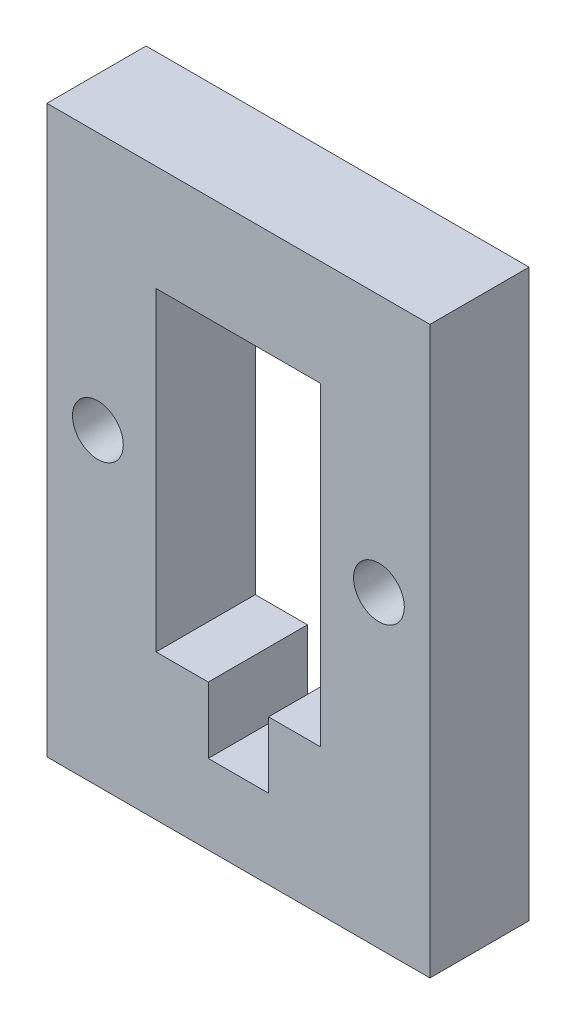
ISO-10303-21;
HEADER;
FILE_DESCRIPTION(('STEP AP214'),'2;1');
FILE_NAME('part.step','',(''),(''),'','','');
FILE_SCHEMA(('AUTOMOTIVE_DESIGN { 1 0 10303 214 1 1 1 1 }'));
ENDSEC;
DATA;
#1=APPLICATION_CONTEXT('core data for automotive mechanical design processes');
#2=APPLICATION_PROTOCOL_DEFINITION('international standard','automotive_design',2000,#1);
#3=PRODUCT_CONTEXT('',#1,'mechanical');
#4=PRODUCT('Part','Part','',(#3));
#5=PRODUCT_RELATED_PRODUCT_CATEGORY('part','',(#4));
#6=PRODUCT_DEFINITION_FORMATION('','',#4);
#7=PRODUCT_DEFINITION_CONTEXT('part definition',#1,'design');
#8=PRODUCT_DEFINITION('design','',#6,#7);
#9=PRODUCT_DEFINITION_SHAPE('','',#8);
#10=(LENGTH_UNIT() NAMED_UNIT(*) SI_UNIT(.MILLI.,.METRE.));
#11=(NAMED_UNIT(*) PLANE_ANGLE_UNIT() SI_UNIT($,.RADIAN.));
#12=(NAMED_UNIT(*) SI_UNIT($,.STERADIAN.) SOLID_ANGLE_UNIT());
#13=UNCERTAINTY_MEASURE_WITH_UNIT(LENGTH_MEASURE(1.E-05),#10,'distance_accuracy_value','');
#14=(GEOMETRIC_REPRESENTATION_CONTEXT(3) GLOBAL_UNCERTAINTY_ASSIGNED_CONTEXT((#13)) GLOBAL_UNIT_ASSIGNED_CONTEXT((#10,
#11,#12)) REPRESENTATION_CONTEXT('',''));
#15=CARTESIAN_POINT('',(0.,0.,0.));
#16=DIRECTION('',(0.,0.,1.));
#17=DIRECTION('',(1.,0.,0.));
#18=AXIS2_PLACEMENT_3D('',#15,#16,#17);
#19=CARTESIAN_POINT('',(-18.5582300884956,31.0897345132743,7.5));
#20=DIRECTION('',(0.,-1.,0.));
#21=DIRECTION('',(0.,0.,-1.));
#22=AXIS2_PLACEMENT_3D('',#19,#20,#21);
#23=PLANE('',#22);
#24=DIRECTION('',(-1.,0.,0.));
#25=VECTOR('',#24,1.);
#26=CARTESIAN_POINT('',(-18.5582300884956,31.0897345132743,7.5));
#27=LINE('',#26,#25);
#28=CARTESIAN_POINT('',(-6.35823008849556,31.0897345132743,7.5));
#29=VERTEX_POINT('',#28);
#30=CARTESIAN_POINT('',(-10.3032300884956,31.0897345132743,7.5));
#31=VERTEX_POINT('',#30);
#32=EDGE_CURVE('E244',#29,#31,#27,.T.);
#33=ORIENTED_EDGE('',*,*,#32,.F.);
#34=DIRECTION('',(0.,0.,1.));
#35=VECTOR('',#34,1.);
#36=CARTESIAN_POINT('',(-6.35823008849556,31.0897345132743,0.));
#37=LINE('',#36,#35);
#38=CARTESIAN_POINT('',(-6.35823008849556,31.0897345132743,0.));
#39=VERTEX_POINT('',#38);
#40=EDGE_CURVE('E138',#39,#29,#37,.T.);
#41=ORIENTED_EDGE('',*,*,#40,.F.);
#42=DIRECTION('',(-1.,0.,0.));
#43=VECTOR('',#42,1.);
#44=CARTESIAN_POINT('',(-18.5582300884956,31.0897345132743,0.));
#45=LINE('',#44,#43);
#46=CARTESIAN_POINT('',(-10.3032300884956,31.0897345132743,0.));
#47=VERTEX_POINT('',#46);
#48=EDGE_CURVE('E256',#39,#47,#45,.T.);
#49=ORIENTED_EDGE('',*,*,#48,.T.);
#50=DIRECTION('',(0.,0.,-1.));
#51=VECTOR('',#50,1.);
#52=CARTESIAN_POINT('',(-10.3032300884956,31.0897345132743,0.));
#53=LINE('',#52,#51);
#54=EDGE_CURVE('E216',#31,#47,#53,.T.);
#55=ORIENTED_EDGE('',*,*,#54,.F.);
#56=EDGE_LOOP('',(#33,#41,#49,#55));
#57=FACE_BOUND('',#56,.T.);
#58=ADVANCED_FACE('F39',(#57),#23,.F.);
#59=CARTESIAN_POINT('',(2.14676991150445,31.0897345132743,0.));
#60=VERTEX_POINT('',#59);
#61=CARTESIAN_POINT('',(-1.79823008849555,31.0897345132743,0.));
#62=VERTEX_POINT('',#61);
#63=EDGE_CURVE('E238',#60,#62,#45,.T.);
#64=ORIENTED_EDGE('',*,*,#63,.T.);
#65=DIRECTION('',(0.,0.,-1.));
#66=VECTOR('',#65,1.);
#67=CARTESIAN_POINT('',(-1.79823008849555,31.0897345132743,0.));
#68=LINE('',#67,#66);
#69=CARTESIAN_POINT('',(-1.79823008849555,31.0897345132743,7.5));
#70=VERTEX_POINT('',#69);
#71=EDGE_CURVE('E152',#70,#62,#68,.T.);
#72=ORIENTED_EDGE('',*,*,#71,.F.);
#73=CARTESIAN_POINT('',(2.14676991150444,31.0897345132743,7.5));
#74=VERTEX_POINT('',#73);
#75=EDGE_CURVE('E65',#74,#70,#27,.T.);
#76=ORIENTED_EDGE('',*,*,#75,.F.);
#77=DIRECTION('',(0.,0.,1.));
#78=VECTOR('',#77,1.);
#79=CARTESIAN_POINT('',(2.14676991150445,31.0897345132743,0.));
#80=LINE('',#79,#78);
#81=EDGE_CURVE('E195',#60,#74,#80,.T.);
#82=ORIENTED_EDGE('',*,*,#81,.F.);
#83=EDGE_LOOP('',(#64,#72,#76,#82));
#84=FACE_BOUND('',#83,.T.);
#85=ADVANCED_FACE('F300',(#84),#23,.F.);
#86=CARTESIAN_POINT('',(-18.5582300884956,31.0897345132743,7.5));
#87=DIRECTION('',(1.,0.,0.));
#88=DIRECTION('',(0.,1.,0.));
#89=AXIS2_PLACEMENT_3D('',#86,#87,#88);
#90=PLANE('',#89);
#91=DIRECTION('',(0.,-1.,0.));
#92=VECTOR('',#91,1.);
#93=CARTESIAN_POINT('',(-18.5582300884956,31.0897345132743,0.));
#94=LINE('',#93,#92);
#95=CARTESIAN_POINT('',(-18.5582300884956,62.8897345132743,0.));
#96=VERTEX_POINT('',#95);
#97=CARTESIAN_POINT('',(-18.5582300884956,20.0897345132743,0.));
#98=VERTEX_POINT('',#97);
#99=EDGE_CURVE('E232',#96,#98,#94,.T.);
#100=ORIENTED_EDGE('',*,*,#99,.T.);
#101=DIRECTION('',(0.,0.,-1.));
#102=VECTOR('',#101,1.);
#103=CARTESIAN_POINT('',(-18.5582300884956,20.0897345132743,7.5));
#104=LINE('',#103,#102);
#105=CARTESIAN_POINT('',(-18.5582300884956,20.0897345132743,7.5));
#106=VERTEX_POINT('',#105);
#107=EDGE_CURVE('E11',#106,#98,#104,.T.);
#108=ORIENTED_EDGE('',*,*,#107,.F.);
#109=DIRECTION('',(0.,-1.,0.));
#110=VECTOR('',#109,1.);
#111=CARTESIAN_POINT('',(-18.5582300884956,31.0897345132743,7.5));
#112=LINE('',#111,#110);
#113=CARTESIAN_POINT('',(-18.5582300884956,62.8897345132743,7.5));
#114=VERTEX_POINT('',#113);
#115=EDGE_CURVE('E233',#114,#106,#112,.T.);
#116=ORIENTED_EDGE('',*,*,#115,.F.);
#117=DIRECTION('',(0.,0.,1.));
#118=VECTOR('',#117,1.);
#119=CARTESIAN_POINT('',(-18.5582300884956,62.8897345132743,0.));
#120=LINE('',#119,#118);
#121=EDGE_CURVE('E178',#96,#114,#120,.T.);
#122=ORIENTED_EDGE('',*,*,#121,.F.);
#123=EDGE_LOOP('',(#100,#108,#116,#122));
#124=FACE_BOUND('',#123,.T.);
#125=ADVANCED_FACE('F41',(#124),#90,.F.);
#126=CARTESIAN_POINT('',(-18.5582300884956,20.0897345132743,7.5));
#127=DIRECTION('',(0.,1.,0.));
#128=DIRECTION('',(0.,0.,1.));
#129=AXIS2_PLACEMENT_3D('',#126,#127,#128);
#130=PLANE('',#129);
#131=DIRECTION('',(1.,0.,0.));
#132=VECTOR('',#131,1.);
#133=CARTESIAN_POINT('',(-18.5582300884956,20.0897345132743,0.));
#134=LINE('',#133,#132);
#135=CARTESIAN_POINT('',(10.4017699115044,20.0897345132743,0.));
#136=VERTEX_POINT('',#135);
#137=EDGE_CURVE('E250',#98,#136,#134,.T.);
#138=ORIENTED_EDGE('',*,*,#137,.T.);
#139=DIRECTION('',(0.,0.,-1.));
#140=VECTOR('',#139,1.);
#141=CARTESIAN_POINT('',(10.4017699115044,20.0897345132743,7.5));
#142=LINE('',#141,#140);
#143=CARTESIAN_POINT('',(10.4017699115044,20.0897345132743,7.5));
#144=VERTEX_POINT('',#143);
#145=EDGE_CURVE('E49',#144,#136,#142,.T.);
#146=ORIENTED_EDGE('',*,*,#145,.F.);
#147=DIRECTION('',(1.,0.,0.));
#148=VECTOR('',#147,1.);
#149=CARTESIAN_POINT('',(-18.5582300884956,20.0897345132743,7.5));
#150=LINE('',#149,#148);
#151=EDGE_CURVE('E237',#106,#144,#150,.T.);
#152=ORIENTED_EDGE('',*,*,#151,.F.);
#153=ORIENTED_EDGE('',*,*,#107,.T.);
#154=EDGE_LOOP('',(#138,#146,#152,#153));
#155=FACE_BOUND('',#154,.T.);
#156=ADVANCED_FACE('F295',(#155),#130,.F.);
#157=CARTESIAN_POINT('',(10.4017699115044,31.0897345132743,7.5));
#158=DIRECTION('',(-1.,0.,0.));
#159=DIRECTION('',(0.,-1.,0.));
#160=AXIS2_PLACEMENT_3D('',#157,#158,#159);
#161=PLANE('',#160);
#162=DIRECTION('',(0.,1.,0.));
#163=VECTOR('',#162,1.);
#164=CARTESIAN_POINT('',(10.4017699115044,31.0897345132743,0.));
#165=LINE('',#164,#163);
#166=CARTESIAN_POINT('',(10.4017699115044,62.8897345132743,0.));
#167=VERTEX_POINT('',#166);
#168=EDGE_CURVE('E253',#136,#167,#165,.T.);
#169=ORIENTED_EDGE('',*,*,#168,.T.);
#170=DIRECTION('',(0.,0.,-1.));
#171=VECTOR('',#170,1.);
#172=CARTESIAN_POINT('',(10.4017699115044,62.8897345132743,0.));
#173=LINE('',#172,#171);
#174=CARTESIAN_POINT('',(10.4017699115044,62.8897345132743,7.5));
#175=VERTEX_POINT('',#174);
#176=EDGE_CURVE('E187',#175,#167,#173,.T.);
#177=ORIENTED_EDGE('',*,*,#176,.F.);
#178=DIRECTION('',(0.,1.,0.));
#179=VECTOR('',#178,1.);
#180=CARTESIAN_POINT('',(10.4017699115044,31.0897345132743,7.5));
#181=LINE('',#180,#179);
#182=EDGE_CURVE('E241',#144,#175,#181,.T.);
#183=ORIENTED_EDGE('',*,*,#182,.F.);
#184=ORIENTED_EDGE('',*,*,#145,.T.);
#185=EDGE_LOOP('',(#169,#177,#183,#184));
#186=FACE_BOUND('',#185,.T.);
#187=ADVANCED_FACE('F285',(#186),#161,.F.);
#188=CARTESIAN_POINT('',(0.,0.,7.5));
#189=DIRECTION('',(0.,0.,1.));
#190=DIRECTION('',(1.,0.,0.));
#191=AXIS2_PLACEMENT_3D('',#188,#189,#190);
#192=PLANE('',#191);
#193=CARTESIAN_POINT('',(-14.7032300884956,43.4097345132743,7.5));
#194=DIRECTION('',(0.,0.,1.));
#195=DIRECTION('',(1.,0.,0.));
#196=AXIS2_PLACEMENT_3D('',#193,#194,#195);
#197=CIRCLE('',#196,1.92);
#198=CARTESIAN_POINT('',(-12.7832300884956,43.4097345132743,7.5));
#199=VERTEX_POINT('',#198);
#200=EDGE_CURVE('E265',#199,#199,#197,.T.);
#201=ORIENTED_EDGE('',*,*,#200,.F.);
#202=EDGE_LOOP('',(#201));
#203=FACE_BOUND('',#202,.T.);
#204=CARTESIAN_POINT('',(6.54676991150445,43.4097345132743,7.5));
#205=DIRECTION('',(0.,0.,1.));
#206=DIRECTION('',(1.,0.,0.));
#207=AXIS2_PLACEMENT_3D('',#204,#205,#206);
#208=CIRCLE('',#207,1.92);
#209=CARTESIAN_POINT('',(8.46676991150445,43.4097345132743,7.5));
#210=VERTEX_POINT('',#209);
#211=EDGE_CURVE('E272',#210,#210,#208,.T.);
#212=ORIENTED_EDGE('',*,*,#211,.F.);
#213=EDGE_LOOP('',(#212));
#214=FACE_BOUND('',#213,.T.);
#215=DIRECTION('',(0.,1.,0.));
#216=VECTOR('',#215,1.);
#217=CARTESIAN_POINT('',(-6.35823008849556,26.0897345132743,7.5));
#218=LINE('',#217,#216);
#219=CARTESIAN_POINT('',(-6.35823008849556,26.0897345132743,7.5));
#220=VERTEX_POINT('',#219);
#221=EDGE_CURVE('E133',#220,#29,#218,.T.);
#222=ORIENTED_EDGE('',*,*,#221,.T.);
#223=ORIENTED_EDGE('',*,*,#32,.T.);
#224=DIRECTION('',(0.,-1.,0.));
#225=VECTOR('',#224,1.);
#226=CARTESIAN_POINT('',(-10.3032300884956,54.8897345132743,7.5));
#227=LINE('',#226,#225);
#228=CARTESIAN_POINT('',(-10.3032300884956,54.8897345132743,7.5));
#229=VERTEX_POINT('',#228);
#230=EDGE_CURVE('E228',#229,#31,#227,.T.);
#231=ORIENTED_EDGE('',*,*,#230,.F.);
#232=DIRECTION('',(1.,0.,0.));
#233=VECTOR('',#232,1.);
#234=CARTESIAN_POINT('',(-18.5582300884956,54.8897345132743,7.5));
#235=LINE('',#234,#233);
#236=CARTESIAN_POINT('',(2.14676991150444,54.8897345132743,7.5));
#237=VERTEX_POINT('',#236);
#238=EDGE_CURVE('E171',#229,#237,#235,.T.);
#239=ORIENTED_EDGE('',*,*,#238,.T.);
#240=DIRECTION('',(0.,-1.,0.));
#241=VECTOR('',#240,1.);
#242=CARTESIAN_POINT('',(2.14676991150444,54.8897345132743,7.5));
#243=LINE('',#242,#241);
#244=EDGE_CURVE('E206',#237,#74,#243,.T.);
#245=ORIENTED_EDGE('',*,*,#244,.T.);
#246=ORIENTED_EDGE('',*,*,#75,.T.);
#247=DIRECTION('',(0.,1.,0.));
#248=VECTOR('',#247,1.);
#249=CARTESIAN_POINT('',(-1.79823008849555,26.0897345132743,7.5));
#250=LINE('',#249,#248);
#251=CARTESIAN_POINT('',(-1.79823008849555,26.0897345132743,7.5));
#252=VERTEX_POINT('',#251);
#253=EDGE_CURVE('E143',#252,#70,#250,.T.);
#254=ORIENTED_EDGE('',*,*,#253,.F.);
#255=DIRECTION('',(1.,0.,0.));
#256=VECTOR('',#255,1.);
#257=CARTESIAN_POINT('',(-6.35823008849556,26.0897345132743,7.5));
#258=LINE('',#257,#256);
#259=EDGE_CURVE('E147',#220,#252,#258,.T.);
#260=ORIENTED_EDGE('',*,*,#259,.F.);
#261=EDGE_LOOP('',(#222,#223,#231,#239,#245,#246,#254,#260));
#262=FACE_BOUND('',#261,.T.);
#263=ORIENTED_EDGE('',*,*,#115,.T.);
#264=ORIENTED_EDGE('',*,*,#151,.T.);
#265=ORIENTED_EDGE('',*,*,#182,.T.);
#266=DIRECTION('',(1.,0.,0.));
#267=VECTOR('',#266,1.);
#268=CARTESIAN_POINT('',(-18.5582300884956,62.8897345132743,7.5));
#269=LINE('',#268,#267);
#270=EDGE_CURVE('E182',#114,#175,#269,.T.);
#271=ORIENTED_EDGE('',*,*,#270,.F.);
#272=EDGE_LOOP('',(#263,#264,#265,#271));
#273=FACE_BOUND('',#272,.T.);
#274=ADVANCED_FACE('F154',(#203,#214,#262,#273),#192,.T.);
#275=CARTESIAN_POINT('',(0.,0.,0.));
#276=DIRECTION('',(0.,0.,1.));
#277=DIRECTION('',(1.,0.,0.));
#278=AXIS2_PLACEMENT_3D('',#275,#276,#277);
#279=PLANE('',#278);
#280=CARTESIAN_POINT('',(-14.7032300884956,43.4097345132743,0.));
#281=DIRECTION('',(0.,0.,1.));
#282=DIRECTION('',(1.,0.,0.));
#283=AXIS2_PLACEMENT_3D('',#280,#281,#282);
#284=CIRCLE('',#283,1.92);
#285=CARTESIAN_POINT('',(-12.7832300884956,43.4097345132743,0.));
#286=VERTEX_POINT('',#285);
#287=EDGE_CURVE('E43',#286,#286,#284,.T.);
#288=ORIENTED_EDGE('',*,*,#287,.T.);
#289=EDGE_LOOP('',(#288));
#290=FACE_BOUND('',#289,.T.);
#291=CARTESIAN_POINT('',(6.54676991150445,43.4097345132743,0.));
#292=DIRECTION('',(0.,0.,1.));
#293=DIRECTION('',(1.,0.,0.));
#294=AXIS2_PLACEMENT_3D('',#291,#292,#293);
#295=CIRCLE('',#294,1.92);
#296=CARTESIAN_POINT('',(8.46676991150445,43.4097345132743,0.));
#297=VERTEX_POINT('',#296);
#298=EDGE_CURVE('E262',#297,#297,#295,.T.);
#299=ORIENTED_EDGE('',*,*,#298,.T.);
#300=EDGE_LOOP('',(#299));
#301=FACE_BOUND('',#300,.T.);
#302=ORIENTED_EDGE('',*,*,#48,.F.);
#303=DIRECTION('',(0.,1.,0.));
#304=VECTOR('',#303,1.);
#305=CARTESIAN_POINT('',(-6.35823008849556,26.0897345132743,0.));
#306=LINE('',#305,#304);
#307=CARTESIAN_POINT('',(-6.35823008849556,26.0897345132743,0.));
#308=VERTEX_POINT('',#307);
#309=EDGE_CURVE('E168',#308,#39,#306,.T.);
#310=ORIENTED_EDGE('',*,*,#309,.F.);
#311=DIRECTION('',(-1.,0.,0.));
#312=VECTOR('',#311,1.);
#313=CARTESIAN_POINT('',(-6.35823008849556,26.0897345132743,0.));
#314=LINE('',#313,#312);
#315=CARTESIAN_POINT('',(-1.79823008849555,26.0897345132743,0.));
#316=VERTEX_POINT('',#315);
#317=EDGE_CURVE('E144',#316,#308,#314,.T.);
#318=ORIENTED_EDGE('',*,*,#317,.F.);
#319=DIRECTION('',(0.,1.,0.));
#320=VECTOR('',#319,1.);
#321=CARTESIAN_POINT('',(-1.79823008849555,26.0897345132743,0.));
#322=LINE('',#321,#320);
#323=EDGE_CURVE('E172',#316,#62,#322,.T.);
#324=ORIENTED_EDGE('',*,*,#323,.T.);
#325=ORIENTED_EDGE('',*,*,#63,.F.);
#326=DIRECTION('',(0.,-1.,0.));
#327=VECTOR('',#326,1.);
#328=CARTESIAN_POINT('',(2.14676991150445,54.8897345132743,0.));
#329=LINE('',#328,#327);
#330=CARTESIAN_POINT('',(2.14676991150444,54.8897345132743,0.));
#331=VERTEX_POINT('',#330);
#332=EDGE_CURVE('E212',#331,#60,#329,.T.);
#333=ORIENTED_EDGE('',*,*,#332,.F.);
#334=DIRECTION('',(-1.,0.,0.));
#335=VECTOR('',#334,1.);
#336=CARTESIAN_POINT('',(-18.5582300884956,54.8897345132743,0.));
#337=LINE('',#336,#335);
#338=CARTESIAN_POINT('',(-10.3032300884956,54.8897345132743,0.));
#339=VERTEX_POINT('',#338);
#340=EDGE_CURVE('E183',#331,#339,#337,.T.);
#341=ORIENTED_EDGE('',*,*,#340,.T.);
#342=DIRECTION('',(0.,-1.,0.));
#343=VECTOR('',#342,1.);
#344=CARTESIAN_POINT('',(-10.3032300884956,54.8897345132743,0.));
#345=LINE('',#344,#343);
#346=EDGE_CURVE('E221',#339,#47,#345,.T.);
#347=ORIENTED_EDGE('',*,*,#346,.T.);
#348=EDGE_LOOP('',(#302,#310,#318,#324,#325,#333,#341,#347));
#349=FACE_BOUND('',#348,.T.);
#350=ORIENTED_EDGE('',*,*,#99,.F.);
#351=DIRECTION('',(-1.,0.,0.));
#352=VECTOR('',#351,1.);
#353=CARTESIAN_POINT('',(-18.5582300884956,62.8897345132743,0.));
#354=LINE('',#353,#352);
#355=EDGE_CURVE('E191',#167,#96,#354,.T.);
#356=ORIENTED_EDGE('',*,*,#355,.F.);
#357=ORIENTED_EDGE('',*,*,#168,.F.);
#358=ORIENTED_EDGE('',*,*,#137,.F.);
#359=EDGE_LOOP('',(#350,#356,#357,#358));
#360=FACE_BOUND('',#359,.T.);
#361=ADVANCED_FACE('F284',(#290,#301,#349,#360),#279,.F.);
#362=CARTESIAN_POINT('',(-10.3032300884956,54.8897345132743,0.));
#363=DIRECTION('',(-1.,0.,0.));
#364=DIRECTION('',(0.,0.,1.));
#365=AXIS2_PLACEMENT_3D('',#362,#363,#364);
#366=PLANE('',#365);
#367=ORIENTED_EDGE('',*,*,#54,.T.);
#368=ORIENTED_EDGE('',*,*,#346,.F.);
#369=DIRECTION('',(0.,0.,-1.));
#370=VECTOR('',#369,1.);
#371=CARTESIAN_POINT('',(-10.3032300884956,54.8897345132743,0.));
#372=LINE('',#371,#370);
#373=EDGE_CURVE('E217',#229,#339,#372,.T.);
#374=ORIENTED_EDGE('',*,*,#373,.F.);
#375=ORIENTED_EDGE('',*,*,#230,.T.);
#376=EDGE_LOOP('',(#367,#368,#374,#375));
#377=FACE_BOUND('',#376,.T.);
#378=ADVANCED_FACE('F292',(#377),#366,.F.);
#379=CARTESIAN_POINT('',(2.14676991150445,54.8897345132743,0.));
#380=DIRECTION('',(1.,0.,0.));
#381=DIRECTION('',(0.,0.,-1.));
#382=AXIS2_PLACEMENT_3D('',#379,#380,#381);
#383=PLANE('',#382);
#384=ORIENTED_EDGE('',*,*,#81,.T.);
#385=ORIENTED_EDGE('',*,*,#244,.F.);
#386=DIRECTION('',(0.,0.,1.));
#387=VECTOR('',#386,1.);
#388=CARTESIAN_POINT('',(2.14676991150445,54.8897345132743,0.));
#389=LINE('',#388,#387);
#390=EDGE_CURVE('E202',#331,#237,#389,.T.);
#391=ORIENTED_EDGE('',*,*,#390,.F.);
#392=ORIENTED_EDGE('',*,*,#332,.T.);
#393=EDGE_LOOP('',(#384,#385,#391,#392));
#394=FACE_BOUND('',#393,.T.);
#395=ADVANCED_FACE('F332',(#394),#383,.F.);
#396=CARTESIAN_POINT('',(0.,54.8897345132743,0.));
#397=DIRECTION('',(0.,1.,0.));
#398=DIRECTION('',(0.,0.,1.));
#399=AXIS2_PLACEMENT_3D('',#396,#397,#398);
#400=PLANE('',#399);
#401=ORIENTED_EDGE('',*,*,#238,.F.);
#402=ORIENTED_EDGE('',*,*,#373,.T.);
#403=ORIENTED_EDGE('',*,*,#340,.F.);
#404=ORIENTED_EDGE('',*,*,#390,.T.);
#405=EDGE_LOOP('',(#401,#402,#403,#404));
#406=FACE_BOUND('',#405,.T.);
#407=ADVANCED_FACE('F324',(#406),#400,.F.);
#408=CARTESIAN_POINT('',(0.,62.8897345132743,0.));
#409=DIRECTION('',(0.,1.,0.));
#410=DIRECTION('',(0.,0.,1.));
#411=AXIS2_PLACEMENT_3D('',#408,#409,#410);
#412=PLANE('',#411);
#413=ORIENTED_EDGE('',*,*,#121,.T.);
#414=ORIENTED_EDGE('',*,*,#270,.T.);
#415=ORIENTED_EDGE('',*,*,#176,.T.);
#416=ORIENTED_EDGE('',*,*,#355,.T.);
#417=EDGE_LOOP('',(#413,#414,#415,#416));
#418=FACE_BOUND('',#417,.T.);
#419=ADVANCED_FACE('F321',(#418),#412,.T.);
#420=CARTESIAN_POINT('',(-6.35823008849556,26.0897345132743,0.));
#421=DIRECTION('',(-1.,0.,0.));
#422=DIRECTION('',(0.,0.,1.));
#423=AXIS2_PLACEMENT_3D('',#420,#421,#422);
#424=PLANE('',#423);
#425=ORIENTED_EDGE('',*,*,#40,.T.);
#426=ORIENTED_EDGE('',*,*,#221,.F.);
#427=DIRECTION('',(0.,0.,1.));
#428=VECTOR('',#427,1.);
#429=CARTESIAN_POINT('',(-6.35823008849556,26.0897345132743,0.));
#430=LINE('',#429,#428);
#431=EDGE_CURVE('E136',#308,#220,#430,.T.);
#432=ORIENTED_EDGE('',*,*,#431,.F.);
#433=ORIENTED_EDGE('',*,*,#309,.T.);
#434=EDGE_LOOP('',(#425,#426,#432,#433));
#435=FACE_BOUND('',#434,.T.);
#436=ADVANCED_FACE('F135',(#435),#424,.F.);
#437=CARTESIAN_POINT('',(-1.79823008849555,26.0897345132743,0.));
#438=DIRECTION('',(1.,0.,0.));
#439=DIRECTION('',(0.,0.,-1.));
#440=AXIS2_PLACEMENT_3D('',#437,#438,#439);
#441=PLANE('',#440);
#442=ORIENTED_EDGE('',*,*,#71,.T.);
#443=ORIENTED_EDGE('',*,*,#323,.F.);
#444=DIRECTION('',(0.,0.,-1.));
#445=VECTOR('',#444,1.);
#446=CARTESIAN_POINT('',(-1.79823008849555,26.0897345132743,0.));
#447=LINE('',#446,#445);
#448=EDGE_CURVE('E57',#252,#316,#447,.T.);
#449=ORIENTED_EDGE('',*,*,#448,.F.);
#450=ORIENTED_EDGE('',*,*,#253,.T.);
#451=EDGE_LOOP('',(#442,#443,#449,#450));
#452=FACE_BOUND('',#451,.T.);
#453=ADVANCED_FACE('F330',(#452),#441,.F.);
#454=CARTESIAN_POINT('',(0.,26.0897345132743,0.));
#455=DIRECTION('',(0.,1.,0.));
#456=DIRECTION('',(0.,0.,1.));
#457=AXIS2_PLACEMENT_3D('',#454,#455,#456);
#458=PLANE('',#457);
#459=ORIENTED_EDGE('',*,*,#431,.T.);
#460=ORIENTED_EDGE('',*,*,#259,.T.);
#461=ORIENTED_EDGE('',*,*,#448,.T.);
#462=ORIENTED_EDGE('',*,*,#317,.T.);
#463=EDGE_LOOP('',(#459,#460,#461,#462));
#464=FACE_BOUND('',#463,.T.);
#465=ADVANCED_FACE('F146',(#464),#458,.T.);
#466=CARTESIAN_POINT('',(6.54676991150445,43.4097345132743,-2.5));
#467=DIRECTION('',(0.,0.,1.));
#468=DIRECTION('',(1.,0.,0.));
#469=AXIS2_PLACEMENT_3D('',#466,#467,#468);
#470=CYLINDRICAL_SURFACE('',#469,1.92);
#471=ORIENTED_EDGE('',*,*,#211,.T.);
#472=EDGE_LOOP('',(#471));
#473=FACE_BOUND('',#472,.T.);
#474=ORIENTED_EDGE('',*,*,#298,.F.);
#475=EDGE_LOOP('',(#474));
#476=FACE_BOUND('',#475,.T.);
#477=ADVANCED_FACE('F280',(#473,#476),#470,.F.);
#478=CARTESIAN_POINT('',(-14.7032300884956,43.4097345132743,-2.5));
#479=DIRECTION('',(0.,0.,1.));
#480=DIRECTION('',(1.,0.,0.));
#481=AXIS2_PLACEMENT_3D('',#478,#479,#480);
#482=CYLINDRICAL_SURFACE('',#481,1.92);
#483=ORIENTED_EDGE('',*,*,#200,.T.);
#484=EDGE_LOOP('',(#483));
#485=FACE_BOUND('',#484,.T.);
#486=ORIENTED_EDGE('',*,*,#287,.F.);
#487=EDGE_LOOP('',(#486));
#488=FACE_BOUND('',#487,.T.);
#489=ADVANCED_FACE('F361',(#485,#488),#482,.F.);
#490=CLOSED_SHELL('',(#58,#85,#125,#156,#187,#274,#361,#378,#395,#407,#419,#436,#453,#465,#477,#489));
#491=MANIFOLD_SOLID_BREP('B2',#490);
#492=ADVANCED_BREP_SHAPE_REPRESENTATION('',(#18,#491),#14);
#493=SHAPE_DEFINITION_REPRESENTATION(#9,#492);
ENDSEC;
END-ISO-10303-21;
